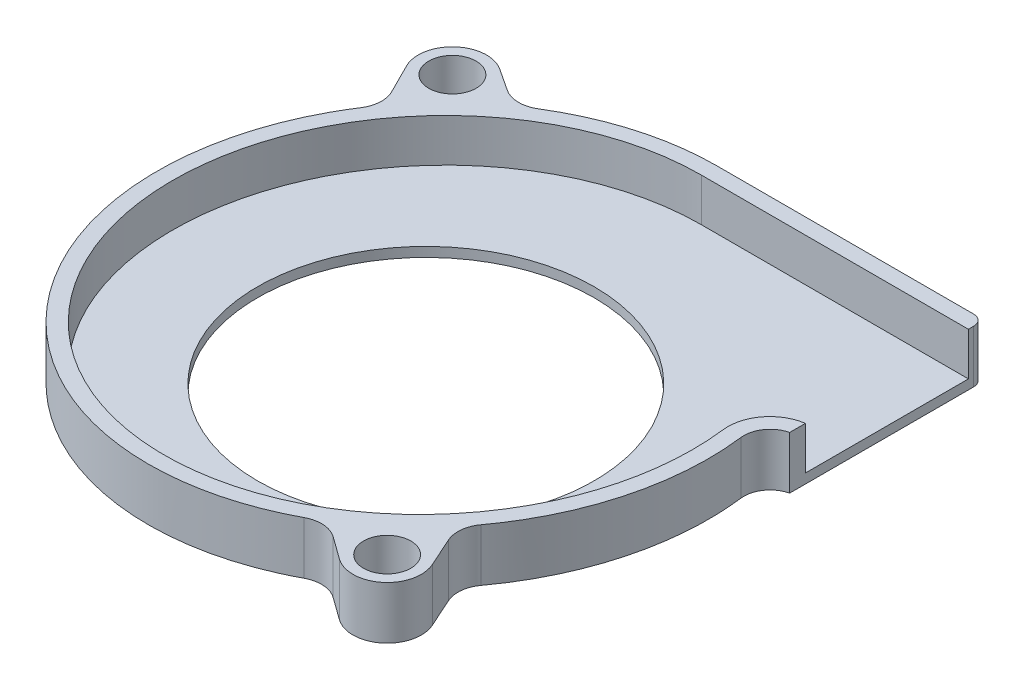
ISO-10303-21;
HEADER;
FILE_DESCRIPTION(('STEP AP214'),'2;1');
FILE_NAME('part.step','',(''),(''),'','','');
FILE_SCHEMA(('AUTOMOTIVE_DESIGN { 1 0 10303 214 1 1 1 1 }'));
ENDSEC;
DATA;
#1=APPLICATION_CONTEXT('core data for automotive mechanical design processes');
#2=APPLICATION_PROTOCOL_DEFINITION('international standard','automotive_design',2000,#1);
#3=PRODUCT_CONTEXT('',#1,'mechanical');
#4=PRODUCT('Part','Part','',(#3));
#5=PRODUCT_RELATED_PRODUCT_CATEGORY('part','',(#4));
#6=PRODUCT_DEFINITION_FORMATION('','',#4);
#7=PRODUCT_DEFINITION_CONTEXT('part definition',#1,'design');
#8=PRODUCT_DEFINITION('design','',#6,#7);
#9=PRODUCT_DEFINITION_SHAPE('','',#8);
#10=(LENGTH_UNIT() NAMED_UNIT(*) SI_UNIT(.MILLI.,.METRE.));
#11=(NAMED_UNIT(*) PLANE_ANGLE_UNIT() SI_UNIT($,.RADIAN.));
#12=(NAMED_UNIT(*) SI_UNIT($,.STERADIAN.) SOLID_ANGLE_UNIT());
#13=UNCERTAINTY_MEASURE_WITH_UNIT(LENGTH_MEASURE(1.E-05),#10,'distance_accuracy_value','');
#14=(GEOMETRIC_REPRESENTATION_CONTEXT(3) GLOBAL_UNCERTAINTY_ASSIGNED_CONTEXT((#13)) GLOBAL_UNIT_ASSIGNED_CONTEXT((#10,
#11,#12)) REPRESENTATION_CONTEXT('',''));
#15=CARTESIAN_POINT('',(0.,0.,0.));
#16=DIRECTION('',(0.,0.,1.));
#17=DIRECTION('',(1.,0.,0.));
#18=AXIS2_PLACEMENT_3D('',#15,#16,#17);
#19=CARTESIAN_POINT('',(-1.25,0.91,-1.9));
#20=DIRECTION('',(0.,1.,0.));
#21=DIRECTION('',(0.,0.,1.));
#22=AXIS2_PLACEMENT_3D('',#19,#20,#21);
#23=PLANE('',#22);
#24=CARTESIAN_POINT('',(0.,0.91,0.));
#25=DIRECTION('',(0.,1.,0.));
#26=DIRECTION('',(0.,0.,1.));
#27=AXIS2_PLACEMENT_3D('',#24,#25,#26);
#28=CIRCLE('',#27,16.);
#29=CARTESIAN_POINT('',(0.,0.91,16.));
#30=VERTEX_POINT('',#29);
#31=EDGE_CURVE('E307',#30,#30,#28,.T.);
#32=ORIENTED_EDGE('',*,*,#31,.F.);
#33=EDGE_LOOP('',(#32));
#34=FACE_BOUND('',#33,.T.);
#35=DIRECTION('',(0.,0.,-1.));
#36=VECTOR('',#35,1.);
#37=CARTESIAN_POINT('',(25.4,0.91,-26.7));
#38=LINE('',#37,#36);
#39=CARTESIAN_POINT('',(25.4,0.91,-10.7));
#40=VERTEX_POINT('',#39);
#41=CARTESIAN_POINT('',(25.4,0.91,-26.2));
#42=VERTEX_POINT('',#41);
#43=EDGE_CURVE('E191',#40,#42,#38,.T.);
#44=ORIENTED_EDGE('',*,*,#43,.T.);
#45=DIRECTION('',(-1.,0.,0.));
#46=VECTOR('',#45,1.);
#47=CARTESIAN_POINT('',(0.014228053199462,0.91,-26.2));
#48=LINE('',#47,#46);
#49=CARTESIAN_POINT('',(0.014228053199462,0.91,-26.2));
#50=VERTEX_POINT('',#49);
#51=EDGE_CURVE('E466',#42,#50,#48,.T.);
#52=ORIENTED_EDGE('',*,*,#51,.T.);
#53=CARTESIAN_POINT('',(-1.25,0.91,-1.9));
#54=DIRECTION('',(0.,1.,0.));
#55=DIRECTION('',(0.469471562785891,0.,-0.882947592858927));
#56=AXIS2_PLACEMENT_3D('',#53,#54,#55);
#57=ELLIPSE('',#56,24.6274274570866,23.1047051659693);
#58=CARTESIAN_POINT('',(22.0098552765877,0.91,-6.24891130438289));
#59=VERTEX_POINT('',#58);
#60=EDGE_CURVE('E209',#50,#59,#57,.T.);
#61=ORIENTED_EDGE('',*,*,#60,.T.);
#62=CARTESIAN_POINT('',(25.979325187646,0.91,-6.74217454566784));
#63=DIRECTION('',(0.,-1.,0.));
#64=DIRECTION('',(0.,0.,-1.));
#65=AXIS2_PLACEMENT_3D('',#62,#63,#64);
#66=CIRCLE('',#65,4.00000000000004);
#67=EDGE_CURVE('E207',#59,#40,#66,.T.);
#68=ORIENTED_EDGE('',*,*,#67,.T.);
#69=EDGE_LOOP('',(#44,#52,#61,#68));
#70=FACE_BOUND('',#69,.T.);
#71=ADVANCED_FACE('F34',(#34,#70),#23,.T.);
#72=CARTESIAN_POINT('',(-1.25,0.,-1.9));
#73=DIRECTION('',(0.,1.,0.));
#74=DIRECTION('',(0.,0.,1.));
#75=AXIS2_PLACEMENT_3D('',#72,#73,#74);
#76=PLANE('',#75);
#77=CARTESIAN_POINT('',(16.3234107002611,0.,20.));
#78=DIRECTION('',(0.,1.,0.));
#79=DIRECTION('',(0.,0.,1.));
#80=AXIS2_PLACEMENT_3D('',#77,#78,#79);
#81=CIRCLE('',#80,2.25);
#82=CARTESIAN_POINT('',(16.3234107002611,0.,22.25));
#83=VERTEX_POINT('',#82);
#84=EDGE_CURVE('E303',#83,#83,#81,.T.);
#85=ORIENTED_EDGE('',*,*,#84,.T.);
#86=EDGE_LOOP('',(#85));
#87=FACE_BOUND('',#86,.T.);
#88=CARTESIAN_POINT('',(-1.25,0.,-1.9));
#89=DIRECTION('',(0.,1.,0.));
#90=DIRECTION('',(-0.469471562785891,0.,0.882947592858927));
#91=AXIS2_PLACEMENT_3D('',#88,#89,#90);
#92=ELLIPSE('',#91,26.1274274570866,24.6069102992367);
#93=CARTESIAN_POINT('',(-0.0105819035035217,0.,-27.7));
#94=VERTEX_POINT('',#93);
#95=CARTESIAN_POINT('',(-13.1979154216619,0.,-23.9076836443924));
#96=VERTEX_POINT('',#95);
#97=EDGE_CURVE('E283',#94,#96,#92,.T.);
#98=ORIENTED_EDGE('',*,*,#97,.F.);
#99=DIRECTION('',(-1.,0.,0.));
#100=VECTOR('',#99,1.);
#101=CARTESIAN_POINT('',(-0.0105819035035217,0.,-27.7));
#102=LINE('',#101,#100);
#103=CARTESIAN_POINT('',(24.4,0.,-27.7));
#104=VERTEX_POINT('',#103);
#105=EDGE_CURVE('E185',#104,#94,#102,.T.);
#106=ORIENTED_EDGE('',*,*,#105,.F.);
#107=CARTESIAN_POINT('',(24.4,0.,-26.7));
#108=DIRECTION('',(0.,1.,0.));
#109=DIRECTION('',(0.,0.,1.));
#110=AXIS2_PLACEMENT_3D('',#107,#108,#109);
#111=CIRCLE('',#110,1.);
#112=CARTESIAN_POINT('',(25.4,0.,-26.7));
#113=VERTEX_POINT('',#112);
#114=EDGE_CURVE('E383',#113,#104,#111,.T.);
#115=ORIENTED_EDGE('',*,*,#114,.F.);
#116=DIRECTION('',(0.,0.,-1.));
#117=VECTOR('',#116,1.);
#118=CARTESIAN_POINT('',(25.4,0.,-26.7));
#119=LINE('',#118,#117);
#120=CARTESIAN_POINT('',(25.4,0.,-9.2));
#121=VERTEX_POINT('',#120);
#122=EDGE_CURVE('E378',#121,#113,#119,.T.);
#123=ORIENTED_EDGE('',*,*,#122,.F.);
#124=CARTESIAN_POINT('',(25.9769692312494,0.,-6.76748966986954));
#125=DIRECTION('',(0.,1.,0.));
#126=DIRECTION('',(0.,0.,1.));
#127=AXIS2_PLACEMENT_3D('',#124,#125,#126);
#128=CIRCLE('',#127,2.5);
#129=CARTESIAN_POINT('',(23.4963580053301,0.,-6.45673583506962));
#130=VERTEX_POINT('',#129);
#131=EDGE_CURVE('E11',#121,#130,#128,.T.);
#132=ORIENTED_EDGE('',*,*,#131,.T.);
#133=CARTESIAN_POINT('',(-1.25,0.,-1.9));
#134=DIRECTION('',(0.,1.,0.));
#135=DIRECTION('',(-0.469471562785891,0.,0.882947592858927));
#136=AXIS2_PLACEMENT_3D('',#133,#134,#135);
#137=ELLIPSE('',#136,26.1274274570866,24.6069102992367);
#138=CARTESIAN_POINT('',(18.329372435693,0.,13.0658386746607));
#139=VERTEX_POINT('',#138);
#140=EDGE_CURVE('E376',#139,#130,#137,.T.);
#141=ORIENTED_EDGE('',*,*,#140,.F.);
#142=CARTESIAN_POINT('',(20.5845955875558,0.,14.725347196875));
#143=DIRECTION('',(0.,-1.,0.));
#144=DIRECTION('',(0.,0.,-1.));
#145=AXIS2_PLACEMENT_3D('',#142,#143,#144);
#146=CIRCLE('',#145,2.8);
#147=CARTESIAN_POINT('',(18.0310662864098,0.,15.8740369322644));
#148=VERTEX_POINT('',#147);
#149=EDGE_CURVE('E366',#148,#139,#146,.T.);
#150=ORIENTED_EDGE('',*,*,#149,.F.);
#151=DIRECTION('',(-0.410246334067643,0.,-0.911974750409275));
#152=VECTOR('',#151,1.);
#153=CARTESIAN_POINT('',(19.2873286390912,0.,18.6666994142802));
#154=LINE('',#153,#152);
#155=CARTESIAN_POINT('',(19.2873286390912,0.,18.6666994142802));
#156=VERTEX_POINT('',#155);
#157=EDGE_CURVE('E358',#156,#148,#154,.T.);
#158=ORIENTED_EDGE('',*,*,#157,.F.);
#159=CARTESIAN_POINT('',(16.3234107002611,0.,20.));
#160=DIRECTION('',(0.,1.,0.));
#161=DIRECTION('',(0.,0.,1.));
#162=AXIS2_PLACEMENT_3D('',#159,#160,#161);
#163=CIRCLE('',#162,3.25);
#164=CARTESIAN_POINT('',(14.4232327633617,0.,22.6366311475291));
#165=VERTEX_POINT('',#164);
#166=EDGE_CURVE('E367',#165,#156,#163,.T.);
#167=ORIENTED_EDGE('',*,*,#166,.F.);
#168=DIRECTION('',(0.811271122316656,0.,0.584670134430581));
#169=VECTOR('',#168,1.);
#170=CARTESIAN_POINT('',(14.4232327633617,0.,22.6366311475291));
#171=LINE('',#170,#169);
#172=CARTESIAN_POINT('',(12.2821486377982,0.,21.0935860309401));
#173=VERTEX_POINT('',#172);
#174=EDGE_CURVE('E715',#173,#165,#171,.T.);
#175=ORIENTED_EDGE('',*,*,#174,.F.);
#176=CARTESIAN_POINT('',(10.6450722613925,0.,23.3651451734267));
#177=DIRECTION('',(0.,-1.,0.));
#178=DIRECTION('',(0.,0.,1.));
#179=AXIS2_PLACEMENT_3D('',#176,#177,#178);
#180=CIRCLE('',#179,2.8);
#181=CARTESIAN_POINT('',(9.32486275644242,0.,20.8959252838585));
#182=VERTEX_POINT('',#181);
#183=EDGE_CURVE('E713',#182,#173,#180,.T.);
#184=ORIENTED_EDGE('',*,*,#183,.F.);
#185=CARTESIAN_POINT('',(-1.25,0.,-1.9));
#186=DIRECTION('',(0.,1.,0.));
#187=DIRECTION('',(-0.469471562785891,0.,0.882947592858927));
#188=AXIS2_PLACEMENT_3D('',#185,#186,#187);
#189=ELLIPSE('',#188,26.1274274570866,24.6069102992367);
#190=CARTESIAN_POINT('',(-21.7385883574107,0.,-15.5524033943181));
#191=VERTEX_POINT('',#190);
#192=EDGE_CURVE('E711',#191,#182,#189,.T.);
#193=ORIENTED_EDGE('',*,*,#192,.F.);
#194=CARTESIAN_POINT('',(-24.0858236778098,0.,-17.0789964477121));
#195=DIRECTION('',(0.,-1.,0.));
#196=DIRECTION('',(0.,0.,-1.));
#197=AXIS2_PLACEMENT_3D('',#194,#195,#196);
#198=CIRCLE('',#197,2.8);
#199=CARTESIAN_POINT('',(-21.5824509490174,0.,-18.3332392394948));
#200=VERTEX_POINT('',#199);
#201=EDGE_CURVE('E709',#200,#191,#198,.T.);
#202=ORIENTED_EDGE('',*,*,#201,.F.);
#203=DIRECTION('',(0.44794385420809,0.,0.894061688854411));
#204=VECTOR('',#203,1.);
#205=CARTESIAN_POINT('',(-23.0057004887768,0.,-21.1739365171215));
#206=LINE('',#205,#204);
#207=CARTESIAN_POINT('',(-23.0057004887768,0.,-21.1739365171215));
#208=VERTEX_POINT('',#207);
#209=EDGE_CURVE('E707',#208,#200,#206,.T.);
#210=ORIENTED_EDGE('',*,*,#209,.F.);
#211=CARTESIAN_POINT('',(-20.1,0.,-22.6297540432978));
#212=DIRECTION('',(0.,1.,0.));
#213=DIRECTION('',(0.,0.,1.));
#214=AXIS2_PLACEMENT_3D('',#211,#212,#213);
#215=CIRCLE('',#214,3.24999999999999);
#216=CARTESIAN_POINT('',(-18.3114983240186,0.,-25.3433792486295));
#217=VERTEX_POINT('',#216);
#218=EDGE_CURVE('E703',#217,#208,#215,.T.);
#219=ORIENTED_EDGE('',*,*,#218,.F.);
#220=DIRECTION('',(-0.834961601640525,0.,-0.550308207994293));
#221=VECTOR('',#220,1.);
#222=CARTESIAN_POINT('',(-18.3114983240186,0.,-25.3433792486295));
#223=LINE('',#222,#221);
#224=CARTESIAN_POINT('',(-16.2051412765258,0.,-23.9551171178627));
#225=VERTEX_POINT('',#224);
#226=EDGE_CURVE('E702',#225,#217,#223,.T.);
#227=ORIENTED_EDGE('',*,*,#226,.F.);
#228=CARTESIAN_POINT('',(-14.6642782941418,0.,-26.2930096024562));
#229=DIRECTION('',(0.,-1.,0.));
#230=DIRECTION('',(0.,0.,1.));
#231=AXIS2_PLACEMENT_3D('',#228,#229,#230);
#232=CIRCLE('',#231,2.8);
#233=EDGE_CURVE('E701',#96,#225,#232,.T.);
#234=ORIENTED_EDGE('',*,*,#233,.F.);
#235=EDGE_LOOP('',(#98,#106,#115,#123,#132,#141,#150,#158,#167,#175,#184,#193,#202,#210,#219,
#227,#234));
#236=FACE_BOUND('',#235,.T.);
#237=CARTESIAN_POINT('',(0.,0.,0.));
#238=DIRECTION('',(0.,1.,0.));
#239=DIRECTION('',(0.,0.,1.));
#240=AXIS2_PLACEMENT_3D('',#237,#238,#239);
#241=CIRCLE('',#240,16.);
#242=CARTESIAN_POINT('',(0.,0.,16.));
#243=VERTEX_POINT('',#242);
#244=EDGE_CURVE('E306',#243,#243,#241,.T.);
#245=ORIENTED_EDGE('',*,*,#244,.T.);
#246=EDGE_LOOP('',(#245));
#247=FACE_BOUND('',#246,.T.);
#248=CARTESIAN_POINT('',(-20.1,0.,-22.6297540432978));
#249=DIRECTION('',(0.,1.,0.));
#250=DIRECTION('',(0.,0.,1.));
#251=AXIS2_PLACEMENT_3D('',#248,#249,#250);
#252=CIRCLE('',#251,2.25);
#253=CARTESIAN_POINT('',(-20.1,0.,-20.3797540432978));
#254=VERTEX_POINT('',#253);
#255=EDGE_CURVE('E300',#254,#254,#252,.T.);
#256=ORIENTED_EDGE('',*,*,#255,.T.);
#257=EDGE_LOOP('',(#256));
#258=FACE_BOUND('',#257,.T.);
#259=ADVANCED_FACE('F254',(#87,#236,#247,#258),#76,.F.);
#260=CARTESIAN_POINT('',(-1.25,0.91,-1.9));
#261=DIRECTION('',(0.,1.,0.));
#262=DIRECTION('',(-0.469471562785891,0.,0.882947592858927));
#263=AXIS2_PLACEMENT_3D('',#260,#261,#262);
#264=ELLIPSE('',#263,26.1274274570866,24.6069102992367);
#265=DIRECTION('',(0.,-1.,0.));
#266=VECTOR('',#265,1.);
#267=SURFACE_OF_LINEAR_EXTRUSION('',#264,#266);
#268=ORIENTED_EDGE('',*,*,#97,.T.);
#269=DIRECTION('',(0.,-1.,0.));
#270=VECTOR('',#269,1.);
#271=CARTESIAN_POINT('',(-13.1979154216619,0.91,-23.9076836443924));
#272=LINE('',#271,#270);
#273=CARTESIAN_POINT('',(-13.1979154216619,5.,-23.9076836443924));
#274=VERTEX_POINT('',#273);
#275=EDGE_CURVE('E206',#274,#96,#272,.T.);
#276=ORIENTED_EDGE('',*,*,#275,.F.);
#277=CARTESIAN_POINT('',(-1.25,5.,-1.9));
#278=DIRECTION('',(0.,-1.,0.));
#279=DIRECTION('',(-0.469471562785892,0.,0.882947592858927));
#280=AXIS2_PLACEMENT_3D('',#277,#278,#279);
#281=ELLIPSE('',#280,26.1274274570866,24.6069102992367);
#282=CARTESIAN_POINT('',(-0.01058190350352,5.,-27.7));
#283=VERTEX_POINT('',#282);
#284=EDGE_CURVE('E198',#274,#283,#281,.T.);
#285=ORIENTED_EDGE('',*,*,#284,.T.);
#286=DIRECTION('',(0.,-1.,0.));
#287=VECTOR('',#286,1.);
#288=CARTESIAN_POINT('',(-0.0105819035035217,0.91,-27.7));
#289=LINE('',#288,#287);
#290=EDGE_CURVE('E179',#283,#94,#289,.T.);
#291=ORIENTED_EDGE('',*,*,#290,.T.);
#292=EDGE_LOOP('',(#268,#276,#285,#291));
#293=FACE_BOUND('',#292,.T.);
#294=ADVANCED_FACE('F204',(#293),#267,.F.);
#295=CARTESIAN_POINT('',(-14.6642782941418,0.91,-26.2930096024562));
#296=DIRECTION('',(0.,-1.,0.));
#297=DIRECTION('',(0.,0.,-1.));
#298=AXIS2_PLACEMENT_3D('',#295,#296,#297);
#299=CYLINDRICAL_SURFACE('',#298,2.8);
#300=ORIENTED_EDGE('',*,*,#233,.T.);
#301=DIRECTION('',(0.,-1.,0.));
#302=VECTOR('',#301,1.);
#303=CARTESIAN_POINT('',(-16.2051412765258,0.91,-23.9551171178627));
#304=LINE('',#303,#302);
#305=CARTESIAN_POINT('',(-16.2051412765258,5.,-23.9551171178627));
#306=VERTEX_POINT('',#305);
#307=EDGE_CURVE('E416',#306,#225,#304,.T.);
#308=ORIENTED_EDGE('',*,*,#307,.F.);
#309=CARTESIAN_POINT('',(-14.6642782941418,5.,-26.2930096024562));
#310=DIRECTION('',(0.,1.,0.));
#311=DIRECTION('',(0.,0.,-1.));
#312=AXIS2_PLACEMENT_3D('',#309,#310,#311);
#313=CIRCLE('',#312,2.8);
#314=EDGE_CURVE('E459',#306,#274,#313,.T.);
#315=ORIENTED_EDGE('',*,*,#314,.T.);
#316=ORIENTED_EDGE('',*,*,#275,.T.);
#317=EDGE_LOOP('',(#300,#308,#315,#316));
#318=FACE_BOUND('',#317,.T.);
#319=ADVANCED_FACE('F314',(#318),#299,.F.);
#320=CARTESIAN_POINT('',(-18.3114983240186,0.91,-25.3433792486295));
#321=DIRECTION('',(-0.550308207994293,0.,0.834961601640525));
#322=DIRECTION('',(0.834961601640525,0.,0.550308207994293));
#323=AXIS2_PLACEMENT_3D('',#320,#321,#322);
#324=PLANE('',#323);
#325=ORIENTED_EDGE('',*,*,#226,.T.);
#326=DIRECTION('',(0.,-1.,0.));
#327=VECTOR('',#326,1.);
#328=CARTESIAN_POINT('',(-18.3114983240186,0.91,-25.3433792486295));
#329=LINE('',#328,#327);
#330=CARTESIAN_POINT('',(-18.3114983240186,5.,-25.3433792486295));
#331=VERTEX_POINT('',#330);
#332=EDGE_CURVE('E413',#331,#217,#329,.T.);
#333=ORIENTED_EDGE('',*,*,#332,.F.);
#334=DIRECTION('',(0.834961601640526,0.,0.55030820799429));
#335=VECTOR('',#334,1.);
#336=CARTESIAN_POINT('',(-18.3114983240186,5.,-25.3433792486295));
#337=LINE('',#336,#335);
#338=EDGE_CURVE('E457',#331,#306,#337,.T.);
#339=ORIENTED_EDGE('',*,*,#338,.T.);
#340=ORIENTED_EDGE('',*,*,#307,.T.);
#341=EDGE_LOOP('',(#325,#333,#339,#340));
#342=FACE_BOUND('',#341,.T.);
#343=ADVANCED_FACE('F317',(#342),#324,.F.);
#344=CARTESIAN_POINT('',(-20.1,0.91,-22.6297540432978));
#345=DIRECTION('',(0.,-1.,0.));
#346=DIRECTION('',(0.,0.,-1.));
#347=AXIS2_PLACEMENT_3D('',#344,#345,#346);
#348=CYLINDRICAL_SURFACE('',#347,3.24999999999999);
#349=ORIENTED_EDGE('',*,*,#218,.T.);
#350=DIRECTION('',(0.,-1.,0.));
#351=VECTOR('',#350,1.);
#352=CARTESIAN_POINT('',(-23.0057004887768,0.91,-21.1739365171215));
#353=LINE('',#352,#351);
#354=CARTESIAN_POINT('',(-23.0057004887768,5.,-21.1739365171215));
#355=VERTEX_POINT('',#354);
#356=EDGE_CURVE('E410',#355,#208,#353,.T.);
#357=ORIENTED_EDGE('',*,*,#356,.F.);
#358=CARTESIAN_POINT('',(-20.1,5.,-22.6297540432978));
#359=DIRECTION('',(0.,-1.,0.));
#360=DIRECTION('',(0.,0.,-1.));
#361=AXIS2_PLACEMENT_3D('',#358,#359,#360);
#362=CIRCLE('',#361,3.24999999999999);
#363=EDGE_CURVE('E454',#355,#331,#362,.T.);
#364=ORIENTED_EDGE('',*,*,#363,.T.);
#365=ORIENTED_EDGE('',*,*,#332,.T.);
#366=EDGE_LOOP('',(#349,#357,#364,#365));
#367=FACE_BOUND('',#366,.T.);
#368=ADVANCED_FACE('F321',(#367),#348,.T.);
#369=CARTESIAN_POINT('',(-23.0057004887768,0.91,-21.1739365171215));
#370=DIRECTION('',(0.894061688854411,0.,-0.44794385420809));
#371=DIRECTION('',(-0.44794385420809,0.,-0.894061688854411));
#372=AXIS2_PLACEMENT_3D('',#369,#370,#371);
#373=PLANE('',#372);
#374=ORIENTED_EDGE('',*,*,#209,.T.);
#375=DIRECTION('',(0.,-1.,0.));
#376=VECTOR('',#375,1.);
#377=CARTESIAN_POINT('',(-21.5824509490174,0.91,-18.3332392394948));
#378=LINE('',#377,#376);
#379=CARTESIAN_POINT('',(-21.5824509490175,5.,-18.3332392394948));
#380=VERTEX_POINT('',#379);
#381=EDGE_CURVE('E407',#380,#200,#378,.T.);
#382=ORIENTED_EDGE('',*,*,#381,.F.);
#383=DIRECTION('',(-0.447943854208092,0.,-0.89406168885441));
#384=VECTOR('',#383,1.);
#385=CARTESIAN_POINT('',(-23.0057004887768,5.,-21.1739365171215));
#386=LINE('',#385,#384);
#387=EDGE_CURVE('E451',#380,#355,#386,.T.);
#388=ORIENTED_EDGE('',*,*,#387,.T.);
#389=ORIENTED_EDGE('',*,*,#356,.T.);
#390=EDGE_LOOP('',(#374,#382,#388,#389));
#391=FACE_BOUND('',#390,.T.);
#392=ADVANCED_FACE('F325',(#391),#373,.F.);
#393=CARTESIAN_POINT('',(-24.0858236778098,0.91,-17.0789964477121));
#394=DIRECTION('',(0.,-1.,0.));
#395=DIRECTION('',(0.,0.,-1.));
#396=AXIS2_PLACEMENT_3D('',#393,#394,#395);
#397=CYLINDRICAL_SURFACE('',#396,2.8);
#398=ORIENTED_EDGE('',*,*,#201,.T.);
#399=DIRECTION('',(0.,-1.,0.));
#400=VECTOR('',#399,1.);
#401=CARTESIAN_POINT('',(-21.7385883574107,0.91,-15.5524033943181));
#402=LINE('',#401,#400);
#403=CARTESIAN_POINT('',(-21.7385883574107,5.,-15.5524033943181));
#404=VERTEX_POINT('',#403);
#405=EDGE_CURVE('E404',#404,#191,#402,.T.);
#406=ORIENTED_EDGE('',*,*,#405,.F.);
#407=CARTESIAN_POINT('',(-24.0858236778098,5.,-17.0789964477121));
#408=DIRECTION('',(0.,1.,0.));
#409=DIRECTION('',(0.,0.,-1.));
#410=AXIS2_PLACEMENT_3D('',#407,#408,#409);
#411=CIRCLE('',#410,2.8);
#412=EDGE_CURVE('E448',#404,#380,#411,.T.);
#413=ORIENTED_EDGE('',*,*,#412,.T.);
#414=ORIENTED_EDGE('',*,*,#381,.T.);
#415=EDGE_LOOP('',(#398,#406,#413,#414));
#416=FACE_BOUND('',#415,.T.);
#417=ADVANCED_FACE('F329',(#416),#397,.F.);
#418=CARTESIAN_POINT('',(-1.25,0.91,-1.9));
#419=DIRECTION('',(0.,1.,0.));
#420=DIRECTION('',(-0.469471562785891,0.,0.882947592858927));
#421=AXIS2_PLACEMENT_3D('',#418,#419,#420);
#422=ELLIPSE('',#421,26.1274274570866,24.6069102992367);
#423=DIRECTION('',(0.,-1.,0.));
#424=VECTOR('',#423,1.);
#425=SURFACE_OF_LINEAR_EXTRUSION('',#422,#424);
#426=ORIENTED_EDGE('',*,*,#192,.T.);
#427=DIRECTION('',(0.,-1.,0.));
#428=VECTOR('',#427,1.);
#429=CARTESIAN_POINT('',(9.32486275644242,0.91,20.8959252838585));
#430=LINE('',#429,#428);
#431=CARTESIAN_POINT('',(9.32486275644242,5.,20.8959252838585));
#432=VERTEX_POINT('',#431);
#433=EDGE_CURVE('E401',#432,#182,#430,.T.);
#434=ORIENTED_EDGE('',*,*,#433,.F.);
#435=CARTESIAN_POINT('',(-1.25,5.,-1.9));
#436=DIRECTION('',(0.,-1.,0.));
#437=DIRECTION('',(-0.469471562785892,0.,0.882947592858927));
#438=AXIS2_PLACEMENT_3D('',#435,#436,#437);
#439=ELLIPSE('',#438,26.1274274570866,24.6069102992367);
#440=EDGE_CURVE('E445',#432,#404,#439,.T.);
#441=ORIENTED_EDGE('',*,*,#440,.T.);
#442=ORIENTED_EDGE('',*,*,#405,.T.);
#443=EDGE_LOOP('',(#426,#434,#441,#442));
#444=FACE_BOUND('',#443,.T.);
#445=ADVANCED_FACE('F333',(#444),#425,.F.);
#446=CARTESIAN_POINT('',(10.6450722613925,0.91,23.3651451734267));
#447=DIRECTION('',(0.,-1.,0.));
#448=DIRECTION('',(0.,0.,-1.));
#449=AXIS2_PLACEMENT_3D('',#446,#447,#448);
#450=CYLINDRICAL_SURFACE('',#449,2.8);
#451=ORIENTED_EDGE('',*,*,#183,.T.);
#452=DIRECTION('',(0.,-1.,0.));
#453=VECTOR('',#452,1.);
#454=CARTESIAN_POINT('',(12.2821486377982,0.91,21.0935860309401));
#455=LINE('',#454,#453);
#456=CARTESIAN_POINT('',(12.2821486377982,5.,21.0935860309401));
#457=VERTEX_POINT('',#456);
#458=EDGE_CURVE('E398',#457,#173,#455,.T.);
#459=ORIENTED_EDGE('',*,*,#458,.F.);
#460=CARTESIAN_POINT('',(10.6450722613925,5.,23.3651451734267));
#461=DIRECTION('',(0.,1.,0.));
#462=DIRECTION('',(0.,0.,-1.));
#463=AXIS2_PLACEMENT_3D('',#460,#461,#462);
#464=CIRCLE('',#463,2.8);
#465=EDGE_CURVE('E442',#457,#432,#464,.T.);
#466=ORIENTED_EDGE('',*,*,#465,.T.);
#467=ORIENTED_EDGE('',*,*,#433,.T.);
#468=EDGE_LOOP('',(#451,#459,#466,#467));
#469=FACE_BOUND('',#468,.T.);
#470=ADVANCED_FACE('F337',(#469),#450,.F.);
#471=CARTESIAN_POINT('',(14.4232327633617,0.91,22.6366311475291));
#472=DIRECTION('',(0.584670134430581,0.,-0.811271122316656));
#473=DIRECTION('',(-0.811271122316656,0.,-0.584670134430581));
#474=AXIS2_PLACEMENT_3D('',#471,#472,#473);
#475=PLANE('',#474);
#476=ORIENTED_EDGE('',*,*,#174,.T.);
#477=DIRECTION('',(0.,-1.,0.));
#478=VECTOR('',#477,1.);
#479=CARTESIAN_POINT('',(14.4232327633617,0.91,22.6366311475291));
#480=LINE('',#479,#478);
#481=CARTESIAN_POINT('',(14.4232327633617,5.,22.6366311475291));
#482=VERTEX_POINT('',#481);
#483=EDGE_CURVE('E395',#482,#165,#480,.T.);
#484=ORIENTED_EDGE('',*,*,#483,.F.);
#485=DIRECTION('',(-0.811271122316656,0.,-0.584670134430581));
#486=VECTOR('',#485,1.);
#487=CARTESIAN_POINT('',(14.4232327633617,5.,22.6366311475291));
#488=LINE('',#487,#486);
#489=EDGE_CURVE('E439',#482,#457,#488,.T.);
#490=ORIENTED_EDGE('',*,*,#489,.T.);
#491=ORIENTED_EDGE('',*,*,#458,.T.);
#492=EDGE_LOOP('',(#476,#484,#490,#491));
#493=FACE_BOUND('',#492,.T.);
#494=ADVANCED_FACE('F341',(#493),#475,.F.);
#495=CARTESIAN_POINT('',(16.3234107002611,0.91,20.));
#496=DIRECTION('',(0.,-1.,0.));
#497=DIRECTION('',(0.,0.,-1.));
#498=AXIS2_PLACEMENT_3D('',#495,#496,#497);
#499=CYLINDRICAL_SURFACE('',#498,3.25);
#500=ORIENTED_EDGE('',*,*,#166,.T.);
#501=DIRECTION('',(0.,-1.,0.));
#502=VECTOR('',#501,1.);
#503=CARTESIAN_POINT('',(19.2873286390912,0.91,18.6666994142802));
#504=LINE('',#503,#502);
#505=CARTESIAN_POINT('',(19.2873286390912,5.,18.6666994142802));
#506=VERTEX_POINT('',#505);
#507=EDGE_CURVE('E363',#506,#156,#504,.T.);
#508=ORIENTED_EDGE('',*,*,#507,.F.);
#509=CARTESIAN_POINT('',(16.3234107002611,5.,20.));
#510=DIRECTION('',(0.,-1.,0.));
#511=DIRECTION('',(0.,0.,-1.));
#512=AXIS2_PLACEMENT_3D('',#509,#510,#511);
#513=CIRCLE('',#512,3.25);
#514=EDGE_CURVE('E436',#506,#482,#513,.T.);
#515=ORIENTED_EDGE('',*,*,#514,.T.);
#516=ORIENTED_EDGE('',*,*,#483,.T.);
#517=EDGE_LOOP('',(#500,#508,#515,#516));
#518=FACE_BOUND('',#517,.T.);
#519=ADVANCED_FACE('F345',(#518),#499,.T.);
#520=CARTESIAN_POINT('',(19.2873286390912,0.91,18.6666994142802));
#521=DIRECTION('',(-0.911974750409275,0.,0.410246334067643));
#522=DIRECTION('',(0.410246334067643,0.,0.911974750409275));
#523=AXIS2_PLACEMENT_3D('',#520,#521,#522);
#524=PLANE('',#523);
#525=ORIENTED_EDGE('',*,*,#157,.T.);
#526=DIRECTION('',(0.,-1.,0.));
#527=VECTOR('',#526,1.);
#528=CARTESIAN_POINT('',(18.0310662864098,0.91,15.8740369322644));
#529=LINE('',#528,#527);
#530=CARTESIAN_POINT('',(18.0310662864098,5.,15.8740369322644));
#531=VERTEX_POINT('',#530);
#532=EDGE_CURVE('E361',#531,#148,#529,.T.);
#533=ORIENTED_EDGE('',*,*,#532,.F.);
#534=DIRECTION('',(0.410246334067644,0.,0.911974750409275));
#535=VECTOR('',#534,1.);
#536=CARTESIAN_POINT('',(19.2873286390912,5.,18.6666994142802));
#537=LINE('',#536,#535);
#538=EDGE_CURVE('E434',#531,#506,#537,.T.);
#539=ORIENTED_EDGE('',*,*,#538,.T.);
#540=ORIENTED_EDGE('',*,*,#507,.T.);
#541=EDGE_LOOP('',(#525,#533,#539,#540));
#542=FACE_BOUND('',#541,.T.);
#543=ADVANCED_FACE('F348',(#542),#524,.F.);
#544=CARTESIAN_POINT('',(20.5845955875558,0.91,14.725347196875));
#545=DIRECTION('',(0.,-1.,0.));
#546=DIRECTION('',(0.,0.,-1.));
#547=AXIS2_PLACEMENT_3D('',#544,#545,#546);
#548=CYLINDRICAL_SURFACE('',#547,2.8);
#549=ORIENTED_EDGE('',*,*,#149,.T.);
#550=DIRECTION('',(0.,-1.,0.));
#551=VECTOR('',#550,1.);
#552=CARTESIAN_POINT('',(18.329372435693,0.91,13.0658386746607));
#553=LINE('',#552,#551);
#554=CARTESIAN_POINT('',(18.329372435693,5.,13.0658386746607));
#555=VERTEX_POINT('',#554);
#556=EDGE_CURVE('E373',#555,#139,#553,.T.);
#557=ORIENTED_EDGE('',*,*,#556,.F.);
#558=CARTESIAN_POINT('',(20.5845955875558,5.,14.725347196875));
#559=DIRECTION('',(0.,1.,0.));
#560=DIRECTION('',(0.,0.,-1.));
#561=AXIS2_PLACEMENT_3D('',#558,#559,#560);
#562=CIRCLE('',#561,2.8);
#563=EDGE_CURVE('E372',#555,#531,#562,.T.);
#564=ORIENTED_EDGE('',*,*,#563,.T.);
#565=ORIENTED_EDGE('',*,*,#532,.T.);
#566=EDGE_LOOP('',(#549,#557,#564,#565));
#567=FACE_BOUND('',#566,.T.);
#568=ADVANCED_FACE('F273',(#567),#548,.F.);
#569=CARTESIAN_POINT('',(-1.25,0.91,-1.9));
#570=DIRECTION('',(0.,1.,0.));
#571=DIRECTION('',(-0.469471562785891,0.,0.882947592858927));
#572=AXIS2_PLACEMENT_3D('',#569,#570,#571);
#573=ELLIPSE('',#572,26.1274274570866,24.6069102992367);
#574=DIRECTION('',(0.,-1.,0.));
#575=VECTOR('',#574,1.);
#576=SURFACE_OF_LINEAR_EXTRUSION('',#573,#575);
#577=ORIENTED_EDGE('',*,*,#140,.T.);
#578=DIRECTION('',(0.,-1.,0.));
#579=VECTOR('',#578,1.);
#580=CARTESIAN_POINT('',(23.4963580053301,0.,-6.45673583506962));
#581=LINE('',#580,#579);
#582=CARTESIAN_POINT('',(23.4963580053301,5.,-6.45673583506962));
#583=VERTEX_POINT('',#582);
#584=EDGE_CURVE('E43',#130,#583,#581,.F.);
#585=ORIENTED_EDGE('',*,*,#584,.T.);
#586=CARTESIAN_POINT('',(-1.25,5.,-1.9));
#587=DIRECTION('',(0.,-1.,0.));
#588=DIRECTION('',(-0.469471562785892,0.,0.882947592858927));
#589=AXIS2_PLACEMENT_3D('',#586,#587,#588);
#590=ELLIPSE('',#589,26.1274274570866,24.6069102992367);
#591=EDGE_CURVE('E422',#583,#555,#590,.T.);
#592=ORIENTED_EDGE('',*,*,#591,.T.);
#593=ORIENTED_EDGE('',*,*,#556,.T.);
#594=EDGE_LOOP('',(#577,#585,#592,#593));
#595=FACE_BOUND('',#594,.T.);
#596=ADVANCED_FACE('F268',(#595),#576,.F.);
#597=CARTESIAN_POINT('',(25.4,0.91,-26.7));
#598=DIRECTION('',(-1.,0.,0.));
#599=DIRECTION('',(0.,0.,1.));
#600=AXIS2_PLACEMENT_3D('',#597,#598,#599);
#601=PLANE('',#600);
#602=ORIENTED_EDGE('',*,*,#122,.T.);
#603=DIRECTION('',(0.,-1.,0.));
#604=VECTOR('',#603,1.);
#605=CARTESIAN_POINT('',(25.4,0.91,-26.7));
#606=LINE('',#605,#604);
#607=CARTESIAN_POINT('',(25.4,5.,-26.7));
#608=VERTEX_POINT('',#607);
#609=EDGE_CURVE('E387',#608,#113,#606,.T.);
#610=ORIENTED_EDGE('',*,*,#609,.F.);
#611=DIRECTION('',(0.,0.,1.));
#612=VECTOR('',#611,1.);
#613=CARTESIAN_POINT('',(25.4,5.,-26.7));
#614=LINE('',#613,#612);
#615=CARTESIAN_POINT('',(25.4,5.,-26.2));
#616=VERTEX_POINT('',#615);
#617=EDGE_CURVE('E216',#608,#616,#614,.T.);
#618=ORIENTED_EDGE('',*,*,#617,.T.);
#619=DIRECTION('',(0.,-1.,0.));
#620=VECTOR('',#619,1.);
#621=CARTESIAN_POINT('',(25.4,5.,-26.2));
#622=LINE('',#621,#620);
#623=EDGE_CURVE('E299',#616,#42,#622,.T.);
#624=ORIENTED_EDGE('',*,*,#623,.T.);
#625=ORIENTED_EDGE('',*,*,#43,.F.);
#626=DIRECTION('',(0.,-1.,0.));
#627=VECTOR('',#626,1.);
#628=CARTESIAN_POINT('',(25.4,5.,-10.7));
#629=LINE('',#628,#627);
#630=CARTESIAN_POINT('',(25.4,5.,-10.7));
#631=VERTEX_POINT('',#630);
#632=EDGE_CURVE('E51',#631,#40,#629,.T.);
#633=ORIENTED_EDGE('',*,*,#632,.F.);
#634=DIRECTION('',(0.,0.,1.));
#635=VECTOR('',#634,1.);
#636=CARTESIAN_POINT('',(25.4,5.,-10.7));
#637=LINE('',#636,#635);
#638=CARTESIAN_POINT('',(25.4,5.,-9.2));
#639=VERTEX_POINT('',#638);
#640=EDGE_CURVE('E430',#631,#639,#637,.T.);
#641=ORIENTED_EDGE('',*,*,#640,.T.);
#642=DIRECTION('',(0.,-1.,0.));
#643=VECTOR('',#642,1.);
#644=CARTESIAN_POINT('',(25.4,0.91,-9.2));
#645=LINE('',#644,#643);
#646=EDGE_CURVE('E390',#639,#121,#645,.T.);
#647=ORIENTED_EDGE('',*,*,#646,.T.);
#648=EDGE_LOOP('',(#602,#610,#618,#624,#625,#633,#641,#647));
#649=FACE_BOUND('',#648,.T.);
#650=ADVANCED_FACE('F264',(#649),#601,.F.);
#651=CARTESIAN_POINT('',(24.4,0.91,-26.7));
#652=DIRECTION('',(0.,-1.,0.));
#653=DIRECTION('',(0.,0.,-1.));
#654=AXIS2_PLACEMENT_3D('',#651,#652,#653);
#655=CYLINDRICAL_SURFACE('',#654,1.);
#656=ORIENTED_EDGE('',*,*,#114,.T.);
#657=DIRECTION('',(0.,-1.,0.));
#658=VECTOR('',#657,1.);
#659=CARTESIAN_POINT('',(24.4,0.91,-27.7));
#660=LINE('',#659,#658);
#661=CARTESIAN_POINT('',(24.4,5.,-27.7));
#662=VERTEX_POINT('',#661);
#663=EDGE_CURVE('E190',#662,#104,#660,.T.);
#664=ORIENTED_EDGE('',*,*,#663,.F.);
#665=CARTESIAN_POINT('',(24.4,5.,-26.7));
#666=DIRECTION('',(0.,-1.,0.));
#667=DIRECTION('',(0.,0.,-1.));
#668=AXIS2_PLACEMENT_3D('',#665,#666,#667);
#669=CIRCLE('',#668,1.);
#670=EDGE_CURVE('E202',#662,#608,#669,.T.);
#671=ORIENTED_EDGE('',*,*,#670,.T.);
#672=ORIENTED_EDGE('',*,*,#609,.T.);
#673=EDGE_LOOP('',(#656,#664,#671,#672));
#674=FACE_BOUND('',#673,.T.);
#675=ADVANCED_FACE('F261',(#674),#655,.T.);
#676=CARTESIAN_POINT('',(-0.0105819035035217,0.91,-27.7));
#677=DIRECTION('',(0.,0.,1.));
#678=DIRECTION('',(1.,0.,0.));
#679=AXIS2_PLACEMENT_3D('',#676,#677,#678);
#680=PLANE('',#679);
#681=ORIENTED_EDGE('',*,*,#105,.T.);
#682=ORIENTED_EDGE('',*,*,#290,.F.);
#683=DIRECTION('',(1.,0.,0.));
#684=VECTOR('',#683,1.);
#685=CARTESIAN_POINT('',(-0.01058190350352,5.,-27.7));
#686=LINE('',#685,#684);
#687=EDGE_CURVE('E183',#283,#662,#686,.T.);
#688=ORIENTED_EDGE('',*,*,#687,.T.);
#689=ORIENTED_EDGE('',*,*,#663,.T.);
#690=EDGE_LOOP('',(#681,#682,#688,#689));
#691=FACE_BOUND('',#690,.T.);
#692=ADVANCED_FACE('F181',(#691),#680,.F.);
#693=CARTESIAN_POINT('',(0.,0.91,0.));
#694=DIRECTION('',(0.,-1.,0.));
#695=DIRECTION('',(0.,0.,-1.));
#696=AXIS2_PLACEMENT_3D('',#693,#694,#695);
#697=CYLINDRICAL_SURFACE('',#696,16.);
#698=ORIENTED_EDGE('',*,*,#31,.T.);
#699=EDGE_LOOP('',(#698));
#700=FACE_BOUND('',#699,.T.);
#701=ORIENTED_EDGE('',*,*,#244,.F.);
#702=EDGE_LOOP('',(#701));
#703=FACE_BOUND('',#702,.T.);
#704=ADVANCED_FACE('F247',(#700,#703),#697,.F.);
#705=CARTESIAN_POINT('',(16.3234107002611,0.91,20.));
#706=DIRECTION('',(0.,-1.,0.));
#707=DIRECTION('',(0.,0.,-1.));
#708=AXIS2_PLACEMENT_3D('',#705,#706,#707);
#709=CYLINDRICAL_SURFACE('',#708,2.25);
#710=ORIENTED_EDGE('',*,*,#84,.F.);
#711=EDGE_LOOP('',(#710));
#712=FACE_BOUND('',#711,.T.);
#713=CARTESIAN_POINT('',(16.3234107002611,5.,20.));
#714=DIRECTION('',(0.,-1.,0.));
#715=DIRECTION('',(0.,0.,-1.));
#716=AXIS2_PLACEMENT_3D('',#713,#714,#715);
#717=CIRCLE('',#716,2.25);
#718=CARTESIAN_POINT('',(16.3234107002611,5.,17.75));
#719=VERTEX_POINT('',#718);
#720=EDGE_CURVE('E471',#719,#719,#717,.T.);
#721=ORIENTED_EDGE('',*,*,#720,.F.);
#722=EDGE_LOOP('',(#721));
#723=FACE_BOUND('',#722,.T.);
#724=ADVANCED_FACE('F243',(#712,#723),#709,.F.);
#725=CARTESIAN_POINT('',(-20.1,0.91,-22.6297540432978));
#726=DIRECTION('',(0.,-1.,0.));
#727=DIRECTION('',(0.,0.,-1.));
#728=AXIS2_PLACEMENT_3D('',#725,#726,#727);
#729=CYLINDRICAL_SURFACE('',#728,2.25);
#730=ORIENTED_EDGE('',*,*,#255,.F.);
#731=EDGE_LOOP('',(#730));
#732=FACE_BOUND('',#731,.T.);
#733=CARTESIAN_POINT('',(-20.1,5.,-22.6297540432978));
#734=DIRECTION('',(0.,-1.,0.));
#735=DIRECTION('',(0.,0.,-1.));
#736=AXIS2_PLACEMENT_3D('',#733,#734,#735);
#737=CIRCLE('',#736,2.25);
#738=CARTESIAN_POINT('',(-20.1,5.,-24.8797540432978));
#739=VERTEX_POINT('',#738);
#740=EDGE_CURVE('E212',#739,#739,#737,.T.);
#741=ORIENTED_EDGE('',*,*,#740,.F.);
#742=EDGE_LOOP('',(#741));
#743=FACE_BOUND('',#742,.T.);
#744=ADVANCED_FACE('F240',(#732,#743),#729,.F.);
#745=CARTESIAN_POINT('',(25.9769692312494,0.455,-6.76748966986954));
#746=DIRECTION('',(0.,-1.,0.));
#747=DIRECTION('',(0.,0.,-1.));
#748=AXIS2_PLACEMENT_3D('',#745,#746,#747);
#749=CYLINDRICAL_SURFACE('',#748,2.5);
#750=ORIENTED_EDGE('',*,*,#646,.F.);
#751=CARTESIAN_POINT('',(25.9769692312494,5.,-6.76748966986954));
#752=DIRECTION('',(0.,1.,0.));
#753=DIRECTION('',(0.,0.,-1.));
#754=AXIS2_PLACEMENT_3D('',#751,#752,#753);
#755=CIRCLE('',#754,2.49999999999999);
#756=EDGE_CURVE('E427',#639,#583,#755,.T.);
#757=ORIENTED_EDGE('',*,*,#756,.T.);
#758=ORIENTED_EDGE('',*,*,#584,.F.);
#759=ORIENTED_EDGE('',*,*,#131,.F.);
#760=EDGE_LOOP('',(#750,#757,#758,#759));
#761=FACE_BOUND('',#760,.T.);
#762=ADVANCED_FACE('F36',(#761),#749,.F.);
#763=CARTESIAN_POINT('',(25.979325187646,5.,-6.74217454566784));
#764=DIRECTION('',(0.,-1.,0.));
#765=DIRECTION('',(0.,0.,-1.));
#766=AXIS2_PLACEMENT_3D('',#763,#764,#765);
#767=CYLINDRICAL_SURFACE('',#766,4.00000000000004);
#768=ORIENTED_EDGE('',*,*,#67,.F.);
#769=DIRECTION('',(0.,-1.,0.));
#770=VECTOR('',#769,1.);
#771=CARTESIAN_POINT('',(22.0098552765877,5.,-6.24891130438289));
#772=LINE('',#771,#770);
#773=CARTESIAN_POINT('',(22.0098552765877,5.,-6.24891130438289));
#774=VERTEX_POINT('',#773);
#775=EDGE_CURVE('E295',#774,#59,#772,.T.);
#776=ORIENTED_EDGE('',*,*,#775,.F.);
#777=CARTESIAN_POINT('',(25.979325187646,5.,-6.74217454566784));
#778=DIRECTION('',(0.,-1.,0.));
#779=DIRECTION('',(0.,0.,-1.));
#780=AXIS2_PLACEMENT_3D('',#777,#778,#779);
#781=CIRCLE('',#780,4.00000000000004);
#782=EDGE_CURVE('E226',#774,#631,#781,.T.);
#783=ORIENTED_EDGE('',*,*,#782,.T.);
#784=ORIENTED_EDGE('',*,*,#632,.T.);
#785=EDGE_LOOP('',(#768,#776,#783,#784));
#786=FACE_BOUND('',#785,.T.);
#787=ADVANCED_FACE('F234',(#786),#767,.T.);
#788=CARTESIAN_POINT('',(-1.25,5.,-1.9));
#789=DIRECTION('',(0.,1.,0.));
#790=DIRECTION('',(0.469471562785891,0.,-0.882947592858927));
#791=AXIS2_PLACEMENT_3D('',#788,#789,#790);
#792=ELLIPSE('',#791,24.6274274570866,23.1047051659693);
#793=DIRECTION('',(0.,-1.,0.));
#794=VECTOR('',#793,1.);
#795=SURFACE_OF_LINEAR_EXTRUSION('',#792,#794);
#796=ORIENTED_EDGE('',*,*,#60,.F.);
#797=DIRECTION('',(0.,-1.,0.));
#798=VECTOR('',#797,1.);
#799=CARTESIAN_POINT('',(0.014228053199462,5.,-26.2));
#800=LINE('',#799,#798);
#801=CARTESIAN_POINT('',(0.014228053199462,5.,-26.2));
#802=VERTEX_POINT('',#801);
#803=EDGE_CURVE('E297',#802,#50,#800,.T.);
#804=ORIENTED_EDGE('',*,*,#803,.F.);
#805=EDGE_CURVE('E222',#802,#774,#792,.T.);
#806=ORIENTED_EDGE('',*,*,#805,.T.);
#807=ORIENTED_EDGE('',*,*,#775,.T.);
#808=EDGE_LOOP('',(#796,#804,#806,#807));
#809=FACE_BOUND('',#808,.T.);
#810=ADVANCED_FACE('F229',(#809),#795,.T.);
#811=CARTESIAN_POINT('',(0.014228053199462,5.,-26.2));
#812=DIRECTION('',(0.,0.,1.));
#813=DIRECTION('',(1.,0.,0.));
#814=AXIS2_PLACEMENT_3D('',#811,#812,#813);
#815=PLANE('',#814);
#816=ORIENTED_EDGE('',*,*,#51,.F.);
#817=ORIENTED_EDGE('',*,*,#623,.F.);
#818=DIRECTION('',(-1.,0.,0.));
#819=VECTOR('',#818,1.);
#820=CARTESIAN_POINT('',(0.014228053199462,5.,-26.2));
#821=LINE('',#820,#819);
#822=EDGE_CURVE('E219',#616,#802,#821,.T.);
#823=ORIENTED_EDGE('',*,*,#822,.T.);
#824=ORIENTED_EDGE('',*,*,#803,.T.);
#825=EDGE_LOOP('',(#816,#817,#823,#824));
#826=FACE_BOUND('',#825,.T.);
#827=ADVANCED_FACE('F233',(#826),#815,.T.);
#828=CARTESIAN_POINT('',(-1.25,5.,-1.9));
#829=DIRECTION('',(0.,-1.,0.));
#830=DIRECTION('',(0.,0.,-1.));
#831=AXIS2_PLACEMENT_3D('',#828,#829,#830);
#832=PLANE('',#831);
#833=ORIENTED_EDGE('',*,*,#720,.T.);
#834=EDGE_LOOP('',(#833));
#835=FACE_BOUND('',#834,.T.);
#836=ORIENTED_EDGE('',*,*,#740,.T.);
#837=EDGE_LOOP('',(#836));
#838=FACE_BOUND('',#837,.T.);
#839=ORIENTED_EDGE('',*,*,#284,.F.);
#840=ORIENTED_EDGE('',*,*,#314,.F.);
#841=ORIENTED_EDGE('',*,*,#338,.F.);
#842=ORIENTED_EDGE('',*,*,#363,.F.);
#843=ORIENTED_EDGE('',*,*,#387,.F.);
#844=ORIENTED_EDGE('',*,*,#412,.F.);
#845=ORIENTED_EDGE('',*,*,#440,.F.);
#846=ORIENTED_EDGE('',*,*,#465,.F.);
#847=ORIENTED_EDGE('',*,*,#489,.F.);
#848=ORIENTED_EDGE('',*,*,#514,.F.);
#849=ORIENTED_EDGE('',*,*,#538,.F.);
#850=ORIENTED_EDGE('',*,*,#563,.F.);
#851=ORIENTED_EDGE('',*,*,#591,.F.);
#852=ORIENTED_EDGE('',*,*,#756,.F.);
#853=ORIENTED_EDGE('',*,*,#640,.F.);
#854=ORIENTED_EDGE('',*,*,#782,.F.);
#855=ORIENTED_EDGE('',*,*,#805,.F.);
#856=ORIENTED_EDGE('',*,*,#822,.F.);
#857=ORIENTED_EDGE('',*,*,#617,.F.);
#858=ORIENTED_EDGE('',*,*,#670,.F.);
#859=ORIENTED_EDGE('',*,*,#687,.F.);
#860=EDGE_LOOP('',(#839,#840,#841,#842,#843,#844,#845,#846,#847,#848,#849,#850,#851,#852,#853,
#854,#855,#856,#857,#858,#859));
#861=FACE_BOUND('',#860,.T.);
#862=ADVANCED_FACE('F196',(#835,#838,#861),#832,.F.);
#863=CLOSED_SHELL('',(#71,#259,#294,#319,#343,#368,#392,#417,#445,#470,#494,#519,#543,#568,#596,
#650,#675,#692,#704,#724,#744,#762,#787,#810,#827,#862));
#864=MANIFOLD_SOLID_BREP('B2',#863);
#865=ADVANCED_BREP_SHAPE_REPRESENTATION('',(#18,#864),#14);
#866=SHAPE_DEFINITION_REPRESENTATION(#9,#865);
ENDSEC;
END-ISO-10303-21;
